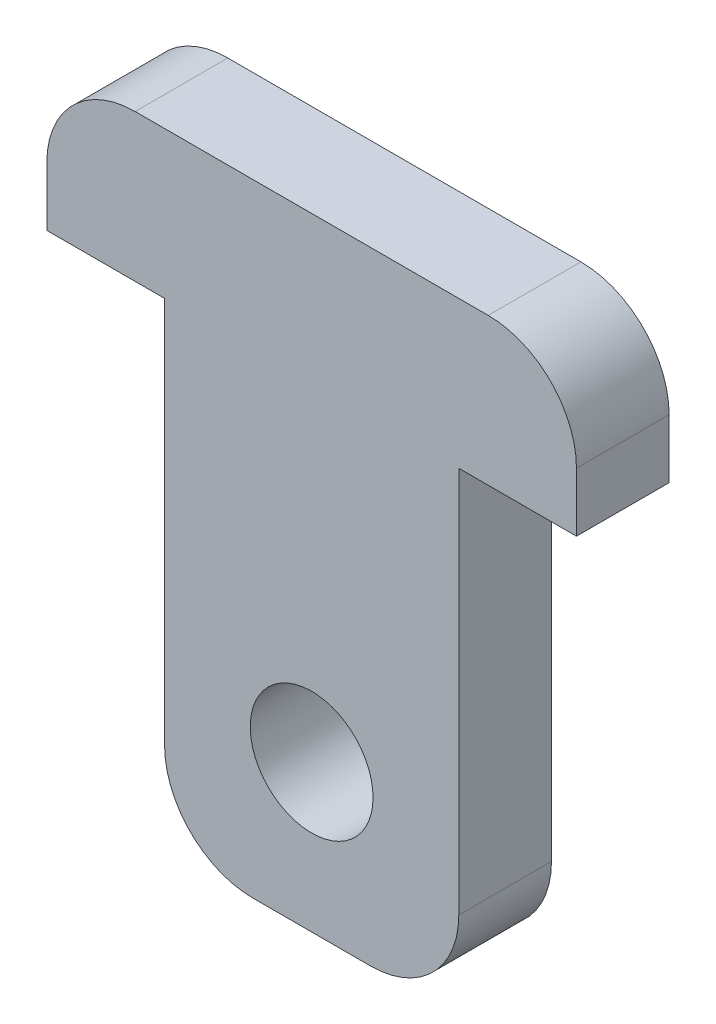
ISO-10303-21;
HEADER;
FILE_DESCRIPTION(('STEP AP214'),'2;1');
FILE_NAME('part.step','',(''),(''),'','','');
FILE_SCHEMA(('AUTOMOTIVE_DESIGN { 1 0 10303 214 1 1 1 1 }'));
ENDSEC;
DATA;
#1=APPLICATION_CONTEXT('core data for automotive mechanical design processes');
#2=APPLICATION_PROTOCOL_DEFINITION('international standard','automotive_design',2000,#1);
#3=PRODUCT_CONTEXT('',#1,'mechanical');
#4=PRODUCT('Part','Part','',(#3));
#5=PRODUCT_RELATED_PRODUCT_CATEGORY('part','',(#4));
#6=PRODUCT_DEFINITION_FORMATION('','',#4);
#7=PRODUCT_DEFINITION_CONTEXT('part definition',#1,'design');
#8=PRODUCT_DEFINITION('design','',#6,#7);
#9=PRODUCT_DEFINITION_SHAPE('','',#8);
#10=(LENGTH_UNIT() NAMED_UNIT(*) SI_UNIT(.MILLI.,.METRE.));
#11=(NAMED_UNIT(*) PLANE_ANGLE_UNIT() SI_UNIT($,.RADIAN.));
#12=(NAMED_UNIT(*) SI_UNIT($,.STERADIAN.) SOLID_ANGLE_UNIT());
#13=UNCERTAINTY_MEASURE_WITH_UNIT(LENGTH_MEASURE(1.E-05),#10,'distance_accuracy_value','');
#14=(GEOMETRIC_REPRESENTATION_CONTEXT(3) GLOBAL_UNCERTAINTY_ASSIGNED_CONTEXT((#13)) GLOBAL_UNIT_ASSIGNED_CONTEXT((#10,
#11,#12)) REPRESENTATION_CONTEXT('',''));
#15=CARTESIAN_POINT('',(0.,0.,0.));
#16=DIRECTION('',(0.,0.,1.));
#17=DIRECTION('',(1.,0.,0.));
#18=AXIS2_PLACEMENT_3D('',#15,#16,#17);
#19=CARTESIAN_POINT('',(8.89,-16.7,4.));
#20=DIRECTION('',(0.,0.,1.));
#21=DIRECTION('',(1.,0.,0.));
#22=AXIS2_PLACEMENT_3D('',#19,#20,#21);
#23=PLANE('',#22);
#24=DIRECTION('',(0.,-1.,0.));
#25=VECTOR('',#24,1.);
#26=CARTESIAN_POINT('',(0.,2.53999999999997,4.));
#27=LINE('',#26,#25);
#28=CARTESIAN_POINT('',(0.,2.53999999999997,4.));
#29=VERTEX_POINT('',#28);
#30=CARTESIAN_POINT('',(0.,0.,4.));
#31=VERTEX_POINT('',#30);
#32=EDGE_CURVE('E206',#29,#31,#27,.T.);
#33=ORIENTED_EDGE('',*,*,#32,.T.);
#34=DIRECTION('',(1.,0.,0.));
#35=VECTOR('',#34,1.);
#36=CARTESIAN_POINT('',(0.,0.,4.));
#37=LINE('',#36,#35);
#38=CARTESIAN_POINT('',(5.08,0.,4.));
#39=VERTEX_POINT('',#38);
#40=EDGE_CURVE('E118',#31,#39,#37,.T.);
#41=ORIENTED_EDGE('',*,*,#40,.T.);
#42=DIRECTION('',(0.,-1.,0.));
#43=VECTOR('',#42,1.);
#44=CARTESIAN_POINT('',(5.08,0.,4.));
#45=LINE('',#44,#43);
#46=CARTESIAN_POINT('',(5.08,-16.7,4.));
#47=VERTEX_POINT('',#46);
#48=EDGE_CURVE('E243',#39,#47,#45,.T.);
#49=ORIENTED_EDGE('',*,*,#48,.T.);
#50=CARTESIAN_POINT('',(8.89,-16.7,4.));
#51=DIRECTION('',(0.,0.,1.));
#52=DIRECTION('',(1.,0.,0.));
#53=AXIS2_PLACEMENT_3D('',#50,#51,#52);
#54=CIRCLE('',#53,3.81);
#55=CARTESIAN_POINT('',(8.89,-20.51,4.));
#56=VERTEX_POINT('',#55);
#57=EDGE_CURVE('E263',#47,#56,#54,.T.);
#58=ORIENTED_EDGE('',*,*,#57,.T.);
#59=DIRECTION('',(1.,0.,0.));
#60=VECTOR('',#59,1.);
#61=CARTESIAN_POINT('',(8.89,-20.51,4.));
#62=LINE('',#61,#60);
#63=CARTESIAN_POINT('',(13.97,-20.51,4.));
#64=VERTEX_POINT('',#63);
#65=EDGE_CURVE('E259',#56,#64,#62,.T.);
#66=ORIENTED_EDGE('',*,*,#65,.T.);
#67=CARTESIAN_POINT('',(13.97,-16.7,4.));
#68=DIRECTION('',(0.,0.,1.));
#69=DIRECTION('',(1.,0.,0.));
#70=AXIS2_PLACEMENT_3D('',#67,#68,#69);
#71=CIRCLE('',#70,3.81);
#72=CARTESIAN_POINT('',(17.78,-16.7,4.));
#73=VERTEX_POINT('',#72);
#74=EDGE_CURVE('E262',#64,#73,#71,.T.);
#75=ORIENTED_EDGE('',*,*,#74,.T.);
#76=DIRECTION('',(0.,1.,0.));
#77=VECTOR('',#76,1.);
#78=CARTESIAN_POINT('',(17.78,-16.7,4.));
#79=LINE('',#78,#77);
#80=CARTESIAN_POINT('',(17.78,0.,4.));
#81=VERTEX_POINT('',#80);
#82=EDGE_CURVE('E267',#73,#81,#79,.T.);
#83=ORIENTED_EDGE('',*,*,#82,.T.);
#84=DIRECTION('',(1.,0.,0.));
#85=VECTOR('',#84,1.);
#86=CARTESIAN_POINT('',(17.78,0.,4.));
#87=LINE('',#86,#85);
#88=CARTESIAN_POINT('',(22.86,0.,4.));
#89=VERTEX_POINT('',#88);
#90=EDGE_CURVE('E274',#81,#89,#87,.T.);
#91=ORIENTED_EDGE('',*,*,#90,.T.);
#92=DIRECTION('',(0.,1.,0.));
#93=VECTOR('',#92,1.);
#94=CARTESIAN_POINT('',(22.86,0.,4.));
#95=LINE('',#94,#93);
#96=CARTESIAN_POINT('',(22.86,2.53999999999998,4.));
#97=VERTEX_POINT('',#96);
#98=EDGE_CURVE('E149',#89,#97,#95,.T.);
#99=ORIENTED_EDGE('',*,*,#98,.T.);
#100=CARTESIAN_POINT('',(19.05,2.54,4.));
#101=DIRECTION('',(0.,0.,1.));
#102=DIRECTION('',(1.,0.,0.));
#103=AXIS2_PLACEMENT_3D('',#100,#101,#102);
#104=CIRCLE('',#103,3.81);
#105=CARTESIAN_POINT('',(19.05,6.35,4.));
#106=VERTEX_POINT('',#105);
#107=EDGE_CURVE('E143',#97,#106,#104,.T.);
#108=ORIENTED_EDGE('',*,*,#107,.T.);
#109=DIRECTION('',(-1.,0.,0.));
#110=VECTOR('',#109,1.);
#111=CARTESIAN_POINT('',(19.05,6.35,4.));
#112=LINE('',#111,#110);
#113=CARTESIAN_POINT('',(3.81000000000003,6.35,4.));
#114=VERTEX_POINT('',#113);
#115=EDGE_CURVE('E147',#106,#114,#112,.T.);
#116=ORIENTED_EDGE('',*,*,#115,.T.);
#117=CARTESIAN_POINT('',(3.81,2.54,4.));
#118=DIRECTION('',(0.,0.,1.));
#119=DIRECTION('',(1.,0.,0.));
#120=AXIS2_PLACEMENT_3D('',#117,#118,#119);
#121=CIRCLE('',#120,3.81);
#122=EDGE_CURVE('E63',#114,#29,#121,.T.);
#123=ORIENTED_EDGE('',*,*,#122,.T.);
#124=EDGE_LOOP('',(#33,#41,#49,#58,#66,#75,#83,#91,#99,#108,#116,#123));
#125=FACE_BOUND('',#124,.T.);
#126=CARTESIAN_POINT('',(11.43,-14.16,4.));
#127=DIRECTION('',(0.,0.,1.));
#128=DIRECTION('',(1.,0.,0.));
#129=AXIS2_PLACEMENT_3D('',#126,#127,#128);
#130=CIRCLE('',#129,2.65);
#131=CARTESIAN_POINT('',(14.08,-14.16,4.));
#132=VERTEX_POINT('',#131);
#133=EDGE_CURVE('E176',#132,#132,#130,.T.);
#134=ORIENTED_EDGE('',*,*,#133,.F.);
#135=EDGE_LOOP('',(#134));
#136=FACE_BOUND('',#135,.T.);
#137=ADVANCED_FACE('F45',(#125,#136),#23,.T.);
#138=CARTESIAN_POINT('',(8.89,-16.7,0.));
#139=DIRECTION('',(0.,0.,1.));
#140=DIRECTION('',(1.,0.,0.));
#141=AXIS2_PLACEMENT_3D('',#138,#139,#140);
#142=PLANE('',#141);
#143=DIRECTION('',(0.,-1.,0.));
#144=VECTOR('',#143,1.);
#145=CARTESIAN_POINT('',(0.,2.53999999999997,0.));
#146=LINE('',#145,#144);
#147=CARTESIAN_POINT('',(0.,2.53999999999997,0.));
#148=VERTEX_POINT('',#147);
#149=CARTESIAN_POINT('',(0.,0.,0.));
#150=VERTEX_POINT('',#149);
#151=EDGE_CURVE('E171',#148,#150,#146,.T.);
#152=ORIENTED_EDGE('',*,*,#151,.F.);
#153=CARTESIAN_POINT('',(3.81,2.54,0.));
#154=DIRECTION('',(0.,0.,1.));
#155=DIRECTION('',(1.,0.,0.));
#156=AXIS2_PLACEMENT_3D('',#153,#154,#155);
#157=CIRCLE('',#156,3.81);
#158=CARTESIAN_POINT('',(3.81000000000003,6.35,0.));
#159=VERTEX_POINT('',#158);
#160=EDGE_CURVE('E110',#159,#148,#157,.T.);
#161=ORIENTED_EDGE('',*,*,#160,.F.);
#162=DIRECTION('',(-1.,0.,0.));
#163=VECTOR('',#162,1.);
#164=CARTESIAN_POINT('',(19.05,6.35,0.));
#165=LINE('',#164,#163);
#166=CARTESIAN_POINT('',(19.05,6.35,0.));
#167=VERTEX_POINT('',#166);
#168=EDGE_CURVE('E104',#167,#159,#165,.T.);
#169=ORIENTED_EDGE('',*,*,#168,.F.);
#170=CARTESIAN_POINT('',(19.05,2.54,0.));
#171=DIRECTION('',(0.,0.,1.));
#172=DIRECTION('',(1.,0.,0.));
#173=AXIS2_PLACEMENT_3D('',#170,#171,#172);
#174=CIRCLE('',#173,3.81);
#175=CARTESIAN_POINT('',(22.86,2.53999999999998,0.));
#176=VERTEX_POINT('',#175);
#177=EDGE_CURVE('E158',#176,#167,#174,.T.);
#178=ORIENTED_EDGE('',*,*,#177,.F.);
#179=DIRECTION('',(0.,1.,0.));
#180=VECTOR('',#179,1.);
#181=CARTESIAN_POINT('',(22.86,0.,0.));
#182=LINE('',#181,#180);
#183=CARTESIAN_POINT('',(22.86,0.,0.));
#184=VERTEX_POINT('',#183);
#185=EDGE_CURVE('E197',#184,#176,#182,.T.);
#186=ORIENTED_EDGE('',*,*,#185,.F.);
#187=DIRECTION('',(1.,0.,0.));
#188=VECTOR('',#187,1.);
#189=CARTESIAN_POINT('',(17.78,0.,0.));
#190=LINE('',#189,#188);
#191=CARTESIAN_POINT('',(17.78,0.,0.));
#192=VERTEX_POINT('',#191);
#193=EDGE_CURVE('E194',#192,#184,#190,.T.);
#194=ORIENTED_EDGE('',*,*,#193,.F.);
#195=DIRECTION('',(0.,1.,0.));
#196=VECTOR('',#195,1.);
#197=CARTESIAN_POINT('',(17.78,-16.7,0.));
#198=LINE('',#197,#196);
#199=CARTESIAN_POINT('',(17.78,-16.7,0.));
#200=VERTEX_POINT('',#199);
#201=EDGE_CURVE('E191',#200,#192,#198,.T.);
#202=ORIENTED_EDGE('',*,*,#201,.F.);
#203=CARTESIAN_POINT('',(13.97,-16.7,0.));
#204=DIRECTION('',(0.,0.,1.));
#205=DIRECTION('',(1.,0.,0.));
#206=AXIS2_PLACEMENT_3D('',#203,#204,#205);
#207=CIRCLE('',#206,3.81);
#208=CARTESIAN_POINT('',(13.97,-20.51,0.));
#209=VERTEX_POINT('',#208);
#210=EDGE_CURVE('E188',#209,#200,#207,.T.);
#211=ORIENTED_EDGE('',*,*,#210,.F.);
#212=DIRECTION('',(1.,0.,0.));
#213=VECTOR('',#212,1.);
#214=CARTESIAN_POINT('',(8.89,-20.51,0.));
#215=LINE('',#214,#213);
#216=CARTESIAN_POINT('',(8.89,-20.51,0.));
#217=VERTEX_POINT('',#216);
#218=EDGE_CURVE('E185',#217,#209,#215,.T.);
#219=ORIENTED_EDGE('',*,*,#218,.F.);
#220=CARTESIAN_POINT('',(8.89,-16.7,0.));
#221=DIRECTION('',(0.,0.,1.));
#222=DIRECTION('',(1.,0.,0.));
#223=AXIS2_PLACEMENT_3D('',#220,#221,#222);
#224=CIRCLE('',#223,3.81);
#225=CARTESIAN_POINT('',(5.08,-16.7,0.));
#226=VERTEX_POINT('',#225);
#227=EDGE_CURVE('E182',#226,#217,#224,.T.);
#228=ORIENTED_EDGE('',*,*,#227,.F.);
#229=DIRECTION('',(0.,-1.,0.));
#230=VECTOR('',#229,1.);
#231=CARTESIAN_POINT('',(5.08,0.,0.));
#232=LINE('',#231,#230);
#233=CARTESIAN_POINT('',(5.08,0.,0.));
#234=VERTEX_POINT('',#233);
#235=EDGE_CURVE('E179',#234,#226,#232,.T.);
#236=ORIENTED_EDGE('',*,*,#235,.F.);
#237=DIRECTION('',(1.,0.,0.));
#238=VECTOR('',#237,1.);
#239=CARTESIAN_POINT('',(0.,0.,0.));
#240=LINE('',#239,#238);
#241=EDGE_CURVE('E175',#150,#234,#240,.T.);
#242=ORIENTED_EDGE('',*,*,#241,.F.);
#243=EDGE_LOOP('',(#152,#161,#169,#178,#186,#194,#202,#211,#219,#228,#236,#242));
#244=FACE_BOUND('',#243,.T.);
#245=CARTESIAN_POINT('',(11.43,-14.16,0.));
#246=DIRECTION('',(0.,0.,1.));
#247=DIRECTION('',(1.,0.,0.));
#248=AXIS2_PLACEMENT_3D('',#245,#246,#247);
#249=CIRCLE('',#248,2.65);
#250=CARTESIAN_POINT('',(14.08,-14.16,0.));
#251=VERTEX_POINT('',#250);
#252=EDGE_CURVE('E423',#251,#251,#249,.T.);
#253=ORIENTED_EDGE('',*,*,#252,.T.);
#254=EDGE_LOOP('',(#253));
#255=FACE_BOUND('',#254,.T.);
#256=ADVANCED_FACE('F247',(#244,#255),#142,.F.);
#257=CARTESIAN_POINT('',(0.,2.53999999999997,4.));
#258=DIRECTION('',(1.,0.,0.));
#259=DIRECTION('',(0.,1.,0.));
#260=AXIS2_PLACEMENT_3D('',#257,#258,#259);
#261=PLANE('',#260);
#262=ORIENTED_EDGE('',*,*,#151,.T.);
#263=DIRECTION('',(0.,0.,-1.));
#264=VECTOR('',#263,1.);
#265=CARTESIAN_POINT('',(0.,0.,4.));
#266=LINE('',#265,#264);
#267=EDGE_CURVE('E11',#31,#150,#266,.T.);
#268=ORIENTED_EDGE('',*,*,#267,.F.);
#269=ORIENTED_EDGE('',*,*,#32,.F.);
#270=DIRECTION('',(0.,0.,-1.));
#271=VECTOR('',#270,1.);
#272=CARTESIAN_POINT('',(0.,2.53999999999997,4.));
#273=LINE('',#272,#271);
#274=EDGE_CURVE('E167',#29,#148,#273,.T.);
#275=ORIENTED_EDGE('',*,*,#274,.T.);
#276=EDGE_LOOP('',(#262,#268,#269,#275));
#277=FACE_BOUND('',#276,.T.);
#278=ADVANCED_FACE('F47',(#277),#261,.F.);
#279=CARTESIAN_POINT('',(0.,0.,4.));
#280=DIRECTION('',(0.,1.,0.));
#281=DIRECTION('',(0.,0.,1.));
#282=AXIS2_PLACEMENT_3D('',#279,#280,#281);
#283=PLANE('',#282);
#284=ORIENTED_EDGE('',*,*,#241,.T.);
#285=DIRECTION('',(0.,0.,-1.));
#286=VECTOR('',#285,1.);
#287=CARTESIAN_POINT('',(5.08,0.,4.));
#288=LINE('',#287,#286);
#289=EDGE_CURVE('E55',#39,#234,#288,.T.);
#290=ORIENTED_EDGE('',*,*,#289,.F.);
#291=ORIENTED_EDGE('',*,*,#40,.F.);
#292=ORIENTED_EDGE('',*,*,#267,.T.);
#293=EDGE_LOOP('',(#284,#290,#291,#292));
#294=FACE_BOUND('',#293,.T.);
#295=ADVANCED_FACE('F310',(#294),#283,.F.);
#296=CARTESIAN_POINT('',(5.08,0.,4.));
#297=DIRECTION('',(1.,0.,0.));
#298=DIRECTION('',(0.,1.,0.));
#299=AXIS2_PLACEMENT_3D('',#296,#297,#298);
#300=PLANE('',#299);
#301=ORIENTED_EDGE('',*,*,#235,.T.);
#302=DIRECTION('',(0.,0.,-1.));
#303=VECTOR('',#302,1.);
#304=CARTESIAN_POINT('',(5.08,-16.7,4.));
#305=LINE('',#304,#303);
#306=EDGE_CURVE('E233',#47,#226,#305,.T.);
#307=ORIENTED_EDGE('',*,*,#306,.F.);
#308=ORIENTED_EDGE('',*,*,#48,.F.);
#309=ORIENTED_EDGE('',*,*,#289,.T.);
#310=EDGE_LOOP('',(#301,#307,#308,#309));
#311=FACE_BOUND('',#310,.T.);
#312=ADVANCED_FACE('F241',(#311),#300,.F.);
#313=CARTESIAN_POINT('',(8.89,-16.7,4.));
#314=DIRECTION('',(0.,0.,-1.));
#315=DIRECTION('',(-1.,0.,0.));
#316=AXIS2_PLACEMENT_3D('',#313,#314,#315);
#317=CYLINDRICAL_SURFACE('',#316,3.81);
#318=ORIENTED_EDGE('',*,*,#227,.T.);
#319=DIRECTION('',(0.,0.,-1.));
#320=VECTOR('',#319,1.);
#321=CARTESIAN_POINT('',(8.89,-20.51,4.));
#322=LINE('',#321,#320);
#323=EDGE_CURVE('E229',#56,#217,#322,.T.);
#324=ORIENTED_EDGE('',*,*,#323,.F.);
#325=ORIENTED_EDGE('',*,*,#57,.F.);
#326=ORIENTED_EDGE('',*,*,#306,.T.);
#327=EDGE_LOOP('',(#318,#324,#325,#326));
#328=FACE_BOUND('',#327,.T.);
#329=ADVANCED_FACE('F253',(#328),#317,.T.);
#330=CARTESIAN_POINT('',(8.89,-20.51,4.));
#331=DIRECTION('',(0.,1.,0.));
#332=DIRECTION('',(0.,0.,1.));
#333=AXIS2_PLACEMENT_3D('',#330,#331,#332);
#334=PLANE('',#333);
#335=ORIENTED_EDGE('',*,*,#218,.T.);
#336=DIRECTION('',(0.,0.,-1.));
#337=VECTOR('',#336,1.);
#338=CARTESIAN_POINT('',(13.97,-20.51,4.));
#339=LINE('',#338,#337);
#340=EDGE_CURVE('E225',#64,#209,#339,.T.);
#341=ORIENTED_EDGE('',*,*,#340,.F.);
#342=ORIENTED_EDGE('',*,*,#65,.F.);
#343=ORIENTED_EDGE('',*,*,#323,.T.);
#344=EDGE_LOOP('',(#335,#341,#342,#343));
#345=FACE_BOUND('',#344,.T.);
#346=ADVANCED_FACE('F257',(#345),#334,.F.);
#347=CARTESIAN_POINT('',(13.97,-16.7,4.));
#348=DIRECTION('',(0.,0.,-1.));
#349=DIRECTION('',(-1.,0.,0.));
#350=AXIS2_PLACEMENT_3D('',#347,#348,#349);
#351=CYLINDRICAL_SURFACE('',#350,3.81);
#352=ORIENTED_EDGE('',*,*,#210,.T.);
#353=DIRECTION('',(0.,0.,-1.));
#354=VECTOR('',#353,1.);
#355=CARTESIAN_POINT('',(17.78,-16.7,4.));
#356=LINE('',#355,#354);
#357=EDGE_CURVE('E221',#73,#200,#356,.T.);
#358=ORIENTED_EDGE('',*,*,#357,.F.);
#359=ORIENTED_EDGE('',*,*,#74,.F.);
#360=ORIENTED_EDGE('',*,*,#340,.T.);
#361=EDGE_LOOP('',(#352,#358,#359,#360));
#362=FACE_BOUND('',#361,.T.);
#363=ADVANCED_FACE('F323',(#362),#351,.T.);
#364=CARTESIAN_POINT('',(17.78,-16.7,4.));
#365=DIRECTION('',(-1.,0.,0.));
#366=DIRECTION('',(0.,-1.,0.));
#367=AXIS2_PLACEMENT_3D('',#364,#365,#366);
#368=PLANE('',#367);
#369=ORIENTED_EDGE('',*,*,#201,.T.);
#370=DIRECTION('',(0.,0.,-1.));
#371=VECTOR('',#370,1.);
#372=CARTESIAN_POINT('',(17.78,0.,4.));
#373=LINE('',#372,#371);
#374=EDGE_CURVE('E217',#81,#192,#373,.T.);
#375=ORIENTED_EDGE('',*,*,#374,.F.);
#376=ORIENTED_EDGE('',*,*,#82,.F.);
#377=ORIENTED_EDGE('',*,*,#357,.T.);
#378=EDGE_LOOP('',(#369,#375,#376,#377));
#379=FACE_BOUND('',#378,.T.);
#380=ADVANCED_FACE('F326',(#379),#368,.F.);
#381=CARTESIAN_POINT('',(17.78,0.,4.));
#382=DIRECTION('',(0.,1.,0.));
#383=DIRECTION('',(0.,0.,1.));
#384=AXIS2_PLACEMENT_3D('',#381,#382,#383);
#385=PLANE('',#384);
#386=ORIENTED_EDGE('',*,*,#193,.T.);
#387=DIRECTION('',(0.,0.,-1.));
#388=VECTOR('',#387,1.);
#389=CARTESIAN_POINT('',(22.86,0.,4.));
#390=LINE('',#389,#388);
#391=EDGE_CURVE('E213',#89,#184,#390,.T.);
#392=ORIENTED_EDGE('',*,*,#391,.F.);
#393=ORIENTED_EDGE('',*,*,#90,.F.);
#394=ORIENTED_EDGE('',*,*,#374,.T.);
#395=EDGE_LOOP('',(#386,#392,#393,#394));
#396=FACE_BOUND('',#395,.T.);
#397=ADVANCED_FACE('F282',(#396),#385,.F.);
#398=CARTESIAN_POINT('',(22.86,0.,4.));
#399=DIRECTION('',(-1.,0.,0.));
#400=DIRECTION('',(0.,0.,1.));
#401=AXIS2_PLACEMENT_3D('',#398,#399,#400);
#402=PLANE('',#401);
#403=ORIENTED_EDGE('',*,*,#185,.T.);
#404=DIRECTION('',(0.,0.,-1.));
#405=VECTOR('',#404,1.);
#406=CARTESIAN_POINT('',(22.86,2.53999999999998,4.));
#407=LINE('',#406,#405);
#408=EDGE_CURVE('E160',#97,#176,#407,.T.);
#409=ORIENTED_EDGE('',*,*,#408,.F.);
#410=ORIENTED_EDGE('',*,*,#98,.F.);
#411=ORIENTED_EDGE('',*,*,#391,.T.);
#412=EDGE_LOOP('',(#403,#409,#410,#411));
#413=FACE_BOUND('',#412,.T.);
#414=ADVANCED_FACE('F286',(#413),#402,.F.);
#415=CARTESIAN_POINT('',(19.05,2.54,4.));
#416=DIRECTION('',(0.,0.,-1.));
#417=DIRECTION('',(-1.,0.,0.));
#418=AXIS2_PLACEMENT_3D('',#415,#416,#417);
#419=CYLINDRICAL_SURFACE('',#418,3.81);
#420=ORIENTED_EDGE('',*,*,#177,.T.);
#421=DIRECTION('',(0.,0.,-1.));
#422=VECTOR('',#421,1.);
#423=CARTESIAN_POINT('',(19.05,6.35,4.));
#424=LINE('',#423,#422);
#425=EDGE_CURVE('E155',#106,#167,#424,.T.);
#426=ORIENTED_EDGE('',*,*,#425,.F.);
#427=ORIENTED_EDGE('',*,*,#107,.F.);
#428=ORIENTED_EDGE('',*,*,#408,.T.);
#429=EDGE_LOOP('',(#420,#426,#427,#428));
#430=FACE_BOUND('',#429,.T.);
#431=ADVANCED_FACE('F156',(#430),#419,.T.);
#432=CARTESIAN_POINT('',(19.05,6.35,4.));
#433=DIRECTION('',(0.,-1.,0.));
#434=DIRECTION('',(1.,0.,0.));
#435=AXIS2_PLACEMENT_3D('',#432,#433,#434);
#436=PLANE('',#435);
#437=ORIENTED_EDGE('',*,*,#168,.T.);
#438=DIRECTION('',(0.,0.,-1.));
#439=VECTOR('',#438,1.);
#440=CARTESIAN_POINT('',(3.81000000000003,6.35,4.));
#441=LINE('',#440,#439);
#442=EDGE_CURVE('E161',#114,#159,#441,.T.);
#443=ORIENTED_EDGE('',*,*,#442,.F.);
#444=ORIENTED_EDGE('',*,*,#115,.F.);
#445=ORIENTED_EDGE('',*,*,#425,.T.);
#446=EDGE_LOOP('',(#437,#443,#444,#445));
#447=FACE_BOUND('',#446,.T.);
#448=ADVANCED_FACE('F163',(#447),#436,.F.);
#449=CARTESIAN_POINT('',(3.81,2.54,4.));
#450=DIRECTION('',(0.,0.,-1.));
#451=DIRECTION('',(-1.,0.,0.));
#452=AXIS2_PLACEMENT_3D('',#449,#450,#451);
#453=CYLINDRICAL_SURFACE('',#452,3.81);
#454=ORIENTED_EDGE('',*,*,#160,.T.);
#455=ORIENTED_EDGE('',*,*,#274,.F.);
#456=ORIENTED_EDGE('',*,*,#122,.F.);
#457=ORIENTED_EDGE('',*,*,#442,.T.);
#458=EDGE_LOOP('',(#454,#455,#456,#457));
#459=FACE_BOUND('',#458,.T.);
#460=ADVANCED_FACE('F290',(#459),#453,.T.);
#461=CARTESIAN_POINT('',(11.43,-14.16,4.));
#462=DIRECTION('',(0.,0.,-1.));
#463=DIRECTION('',(-1.,0.,0.));
#464=AXIS2_PLACEMENT_3D('',#461,#462,#463);
#465=CYLINDRICAL_SURFACE('',#464,2.65);
#466=ORIENTED_EDGE('',*,*,#133,.T.);
#467=EDGE_LOOP('',(#466));
#468=FACE_BOUND('',#467,.T.);
#469=ORIENTED_EDGE('',*,*,#252,.F.);
#470=EDGE_LOOP('',(#469));
#471=FACE_BOUND('',#470,.T.);
#472=ADVANCED_FACE('F292',(#468,#471),#465,.F.);
#473=CLOSED_SHELL('',(#137,#256,#278,#295,#312,#329,#346,#363,#380,#397,#414,#431,#448,#460,#472));
#474=MANIFOLD_SOLID_BREP('B2',#473);
#475=ADVANCED_BREP_SHAPE_REPRESENTATION('',(#18,#474),#14);
#476=SHAPE_DEFINITION_REPRESENTATION(#9,#475);
ENDSEC;
END-ISO-10303-21;
